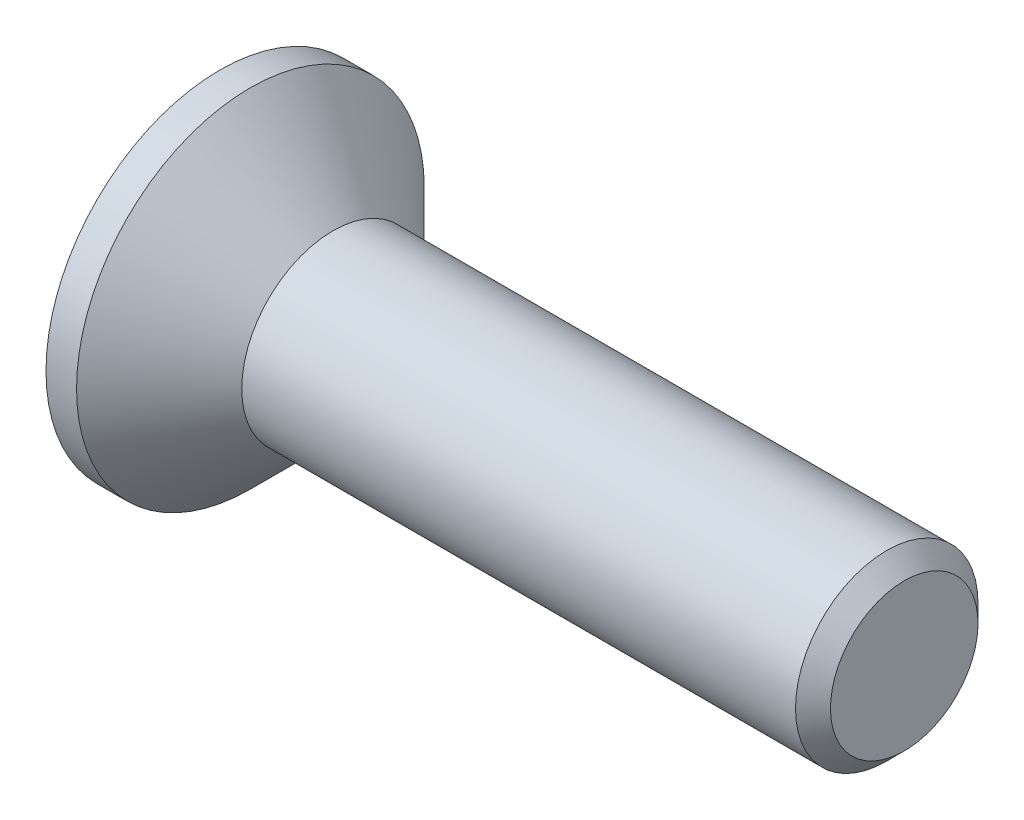
ISO-10303-21;
HEADER;
FILE_DESCRIPTION(('STEP AP214'),'2;1');
FILE_NAME('part.step','',(''),(''),'','','');
FILE_SCHEMA(('AUTOMOTIVE_DESIGN { 1 0 10303 214 1 1 1 1 }'));
ENDSEC;
DATA;
#1=APPLICATION_CONTEXT('core data for automotive mechanical design processes');
#2=APPLICATION_PROTOCOL_DEFINITION('international standard','automotive_design',2000,#1);
#3=PRODUCT_CONTEXT('',#1,'mechanical');
#4=PRODUCT('Part','Part','',(#3));
#5=PRODUCT_RELATED_PRODUCT_CATEGORY('part','',(#4));
#6=PRODUCT_DEFINITION_FORMATION('','',#4);
#7=PRODUCT_DEFINITION_CONTEXT('part definition',#1,'design');
#8=PRODUCT_DEFINITION('design','',#6,#7);
#9=PRODUCT_DEFINITION_SHAPE('','',#8);
#10=(LENGTH_UNIT() NAMED_UNIT(*) SI_UNIT(.MILLI.,.METRE.));
#11=(NAMED_UNIT(*) PLANE_ANGLE_UNIT() SI_UNIT($,.RADIAN.));
#12=(NAMED_UNIT(*) SI_UNIT($,.STERADIAN.) SOLID_ANGLE_UNIT());
#13=UNCERTAINTY_MEASURE_WITH_UNIT(LENGTH_MEASURE(1.E-05),#10,'distance_accuracy_value','');
#14=(GEOMETRIC_REPRESENTATION_CONTEXT(3) GLOBAL_UNCERTAINTY_ASSIGNED_CONTEXT((#13)) GLOBAL_UNIT_ASSIGNED_CONTEXT((#10,
#11,#12)) REPRESENTATION_CONTEXT('',''));
#15=CARTESIAN_POINT('',(0.,0.,0.));
#16=DIRECTION('',(0.,0.,1.));
#17=DIRECTION('',(1.,0.,0.));
#18=AXIS2_PLACEMENT_3D('',#15,#16,#17);
#19=CARTESIAN_POINT('',(3.15,0.,0.));
#20=DIRECTION('',(-1.,0.,0.));
#21=DIRECTION('',(0.,1.,0.));
#22=AXIS2_PLACEMENT_3D('',#19,#20,#21);
#23=CONICAL_SURFACE('',#22,5.81,0.785398163397447);
#24=CARTESIAN_POINT('',(4.96,0.,0.));
#25=DIRECTION('',(1.,0.,0.));
#26=DIRECTION('',(0.,1.,0.));
#27=AXIS2_PLACEMENT_3D('',#24,#25,#26);
#28=CIRCLE('',#27,4.);
#29=CARTESIAN_POINT('',(4.96,-4.,0.));
#30=VERTEX_POINT('',#29);
#31=EDGE_CURVE('E167',#30,#30,#28,.T.);
#32=ORIENTED_EDGE('',*,*,#31,.F.);
#33=DIRECTION('',(-0.707106781186548,-0.707106781186547,0.));
#34=VECTOR('',#33,1.);
#35=CARTESIAN_POINT('',(3.15,-5.81,0.));
#36=LINE('',#35,#34);
#37=CARTESIAN_POINT('',(1.33999999999998,-7.62,0.));
#38=VERTEX_POINT('',#37);
#39=EDGE_CURVE('E10',#30,#38,#36,.T.);
#40=ORIENTED_EDGE('',*,*,#39,.T.);
#41=CARTESIAN_POINT('',(1.33999999999998,0.,0.));
#42=DIRECTION('',(1.,0.,0.));
#43=DIRECTION('',(0.,1.,0.));
#44=AXIS2_PLACEMENT_3D('',#41,#42,#43);
#45=CIRCLE('',#44,7.62);
#46=EDGE_CURVE('E154',#38,#38,#45,.T.);
#47=ORIENTED_EDGE('',*,*,#46,.T.);
#48=ORIENTED_EDGE('',*,*,#39,.F.);
#49=EDGE_LOOP('',(#32,#40,#47,#48));
#50=FACE_BOUND('',#49,.T.);
#51=ADVANCED_FACE('F16',(#50),#23,.T.);
#52=CARTESIAN_POINT('',(0.669999999999988,0.,0.));
#53=DIRECTION('',(1.,0.,0.));
#54=DIRECTION('',(0.,1.,0.));
#55=AXIS2_PLACEMENT_3D('',#52,#53,#54);
#56=CYLINDRICAL_SURFACE('',#55,7.62);
#57=ORIENTED_EDGE('',*,*,#46,.F.);
#58=DIRECTION('',(-1.,0.,0.));
#59=VECTOR('',#58,1.);
#60=CARTESIAN_POINT('',(0.669999999999988,-7.62,0.));
#61=LINE('',#60,#59);
#62=CARTESIAN_POINT('',(0.,-7.62,0.));
#63=VERTEX_POINT('',#62);
#64=EDGE_CURVE('E27',#38,#63,#61,.T.);
#65=ORIENTED_EDGE('',*,*,#64,.T.);
#66=CARTESIAN_POINT('',(0.,0.,0.));
#67=DIRECTION('',(1.,0.,0.));
#68=DIRECTION('',(0.,1.,0.));
#69=AXIS2_PLACEMENT_3D('',#66,#67,#68);
#70=CIRCLE('',#69,7.62);
#71=EDGE_CURVE('E179',#63,#63,#70,.T.);
#72=ORIENTED_EDGE('',*,*,#71,.T.);
#73=ORIENTED_EDGE('',*,*,#64,.F.);
#74=EDGE_LOOP('',(#57,#65,#72,#73));
#75=FACE_BOUND('',#74,.T.);
#76=ADVANCED_FACE('F290',(#75),#56,.T.);
#77=CARTESIAN_POINT('',(0.,5.25337567297407,0.));
#78=DIRECTION('',(-1.,0.,0.));
#79=DIRECTION('',(0.,1.,0.));
#80=AXIS2_PLACEMENT_3D('',#77,#78,#79);
#81=PLANE('',#80);
#82=DIRECTION('',(0.,0.,1.));
#83=VECTOR('',#82,1.);
#84=CARTESIAN_POINT('',(0.,2.5,0.790745250436345));
#85=LINE('',#84,#83);
#86=CARTESIAN_POINT('',(0.,2.5,-1.44337567297406));
#87=VERTEX_POINT('',#86);
#88=CARTESIAN_POINT('',(0.,2.5,1.44337567297406));
#89=VERTEX_POINT('',#88);
#90=EDGE_CURVE('E114',#87,#89,#85,.T.);
#91=ORIENTED_EDGE('',*,*,#90,.T.);
#92=DIRECTION('',(0.,-0.866025403784438,0.5));
#93=VECTOR('',#92,1.);
#94=CARTESIAN_POINT('',(0.,0.646890323062105,2.51326904379206));
#95=LINE('',#94,#93);
#96=CARTESIAN_POINT('',(0.,0.,2.88675134594813));
#97=VERTEX_POINT('',#96);
#98=EDGE_CURVE('E180',#89,#97,#95,.T.);
#99=ORIENTED_EDGE('',*,*,#98,.T.);
#100=DIRECTION('',(0.,-0.866025403784439,-0.5));
#101=VECTOR('',#100,1.);
#102=CARTESIAN_POINT('',(0.,-1.79330420213813,1.85138668210479));
#103=LINE('',#102,#101);
#104=CARTESIAN_POINT('',(0.,-2.5,1.44337567297406));
#105=VERTEX_POINT('',#104);
#106=EDGE_CURVE('E215',#97,#105,#103,.T.);
#107=ORIENTED_EDGE('',*,*,#106,.T.);
#108=DIRECTION('',(0.,0.,-1.));
#109=VECTOR('',#108,1.);
#110=CARTESIAN_POINT('',(0.,-2.5,-0.652630422537716));
#111=LINE('',#110,#109);
#112=CARTESIAN_POINT('',(0.,-2.5,-1.44337567297406));
#113=VERTEX_POINT('',#112);
#114=EDGE_CURVE('E168',#105,#113,#111,.T.);
#115=ORIENTED_EDGE('',*,*,#114,.T.);
#116=DIRECTION('',(0.,0.866025403784439,-0.5));
#117=VECTOR('',#116,1.);
#118=CARTESIAN_POINT('',(0.,-0.603109676937896,-2.53854581161717));
#119=LINE('',#118,#117);
#120=CARTESIAN_POINT('',(0.,0.,-2.88675134594813));
#121=VERTEX_POINT('',#120);
#122=EDGE_CURVE('E143',#113,#121,#119,.T.);
#123=ORIENTED_EDGE('',*,*,#122,.T.);
#124=DIRECTION('',(0.,0.866025403784439,0.5));
#125=VECTOR('',#124,1.);
#126=CARTESIAN_POINT('',(0.,1.95669579786187,-1.75705250033037));
#127=LINE('',#126,#125);
#128=EDGE_CURVE('E130',#121,#87,#127,.T.);
#129=ORIENTED_EDGE('',*,*,#128,.T.);
#130=EDGE_LOOP('',(#91,#99,#107,#115,#123,#129));
#131=FACE_BOUND('',#130,.T.);
#132=ORIENTED_EDGE('',*,*,#71,.F.);
#133=EDGE_LOOP('',(#132));
#134=FACE_BOUND('',#133,.T.);
#135=ADVANCED_FACE('F212',(#131,#134),#81,.T.);
#136=CARTESIAN_POINT('',(3.83333333333334,0.,0.));
#137=DIRECTION('',(-1.,0.,0.));
#138=DIRECTION('',(0.,1.,0.));
#139=AXIS2_PLACEMENT_3D('',#136,#137,#138);
#140=CONICAL_SURFACE('',#139,1.44337567297406,1.0471975511966);
#141=DIRECTION('',(-0.5,-0.866025403784439,0.));
#142=VECTOR('',#141,1.);
#143=CARTESIAN_POINT('',(3.83333333333334,-1.44337567297406,0.));
#144=LINE('',#143,#142);
#145=CARTESIAN_POINT('',(4.66666666666667,0.,0.));
#146=VERTEX_POINT('',#145);
#147=CARTESIAN_POINT('',(3.22329099369261,-2.5,0.));
#148=VERTEX_POINT('',#147);
#149=EDGE_CURVE('E176',#146,#148,#144,.T.);
#150=ORIENTED_EDGE('',*,*,#149,.T.);
#151=CARTESIAN_POINT('',(3.22329099369261,-2.5,0.));
#152=CARTESIAN_POINT('',(3.22329099369261,-2.5,0.669872981077812));
#153=CARTESIAN_POINT('',(3.,-2.5,1.44337567297407));
#154=(BOUNDED_CURVE() B_SPLINE_CURVE(2,(#151,#152,#153),.UNSPECIFIED.,.F.,
.F.) B_SPLINE_CURVE_WITH_KNOTS((3,3),(0.146054517259741,0.292109034519481),
.UNSPECIFIED.) CURVE() GEOMETRIC_REPRESENTATION_ITEM() RATIONAL_B_SPLINE_CURVE((1.07735026918962,
1.07735026918962,1.)) REPRESENTATION_ITEM(''));
#155=CARTESIAN_POINT('',(3.,-2.5,1.44337567297407));
#156=VERTEX_POINT('',#155);
#157=EDGE_CURVE('E192',#148,#156,#154,.T.);
#158=ORIENTED_EDGE('',*,*,#157,.T.);
#159=CARTESIAN_POINT('',(3.,-2.5,1.44337567297406));
#160=CARTESIAN_POINT('',(3.41666666666667,-1.25,2.1650635094611));
#161=CARTESIAN_POINT('',(3.,0.,2.88675134594813));
#162=(BOUNDED_CURVE() B_SPLINE_CURVE(2,(#159,#160,#161),.UNSPECIFIED.,.F.,
.F.) B_SPLINE_CURVE_WITH_KNOTS((3,3),(0.,0.292109034519481),
.UNSPECIFIED.) CURVE() GEOMETRIC_REPRESENTATION_ITEM() RATIONAL_B_SPLINE_CURVE((1.,
1.15470053837925,1.)) REPRESENTATION_ITEM(''));
#163=CARTESIAN_POINT('',(3.,0.,2.88675134594813));
#164=VERTEX_POINT('',#163);
#165=EDGE_CURVE('E188',#156,#164,#162,.T.);
#166=ORIENTED_EDGE('',*,*,#165,.T.);
#167=CARTESIAN_POINT('',(3.,0.,2.88675134594813));
#168=CARTESIAN_POINT('',(3.41666666666667,1.25,2.1650635094611));
#169=CARTESIAN_POINT('',(3.,2.5,1.44337567297406));
#170=(BOUNDED_CURVE() B_SPLINE_CURVE(2,(#167,#168,#169),.UNSPECIFIED.,.F.,
.F.) B_SPLINE_CURVE_WITH_KNOTS((3,3),(0.,0.292109034519482),
.UNSPECIFIED.) CURVE() GEOMETRIC_REPRESENTATION_ITEM() RATIONAL_B_SPLINE_CURVE((1.,
1.15470053837925,1.)) REPRESENTATION_ITEM(''));
#171=CARTESIAN_POINT('',(3.,2.5,1.44337567297406));
#172=VERTEX_POINT('',#171);
#173=EDGE_CURVE('E127',#164,#172,#170,.T.);
#174=ORIENTED_EDGE('',*,*,#173,.T.);
#175=CARTESIAN_POINT('',(3.,2.5,1.44337567297407));
#176=CARTESIAN_POINT('',(3.41666666666667,2.5,0.));
#177=CARTESIAN_POINT('',(3.,2.5,-1.44337567297407));
#178=(BOUNDED_CURVE() B_SPLINE_CURVE(2,(#175,#176,#177),.UNSPECIFIED.,.F.,
.F.) B_SPLINE_CURVE_WITH_KNOTS((3,3),(0.,0.292109034519481),
.UNSPECIFIED.) CURVE() GEOMETRIC_REPRESENTATION_ITEM() RATIONAL_B_SPLINE_CURVE((1.,
1.15470053837926,1.)) REPRESENTATION_ITEM(''));
#179=CARTESIAN_POINT('',(3.,2.5,-1.44337567297407));
#180=VERTEX_POINT('',#179);
#181=EDGE_CURVE('E121',#172,#180,#178,.T.);
#182=ORIENTED_EDGE('',*,*,#181,.T.);
#183=CARTESIAN_POINT('',(3.,2.5,-1.44337567297406));
#184=CARTESIAN_POINT('',(3.41666666666667,1.25,-2.1650635094611));
#185=CARTESIAN_POINT('',(3.,0.,-2.88675134594813));
#186=(BOUNDED_CURVE() B_SPLINE_CURVE(2,(#183,#184,#185),.UNSPECIFIED.,.F.,
.F.) B_SPLINE_CURVE_WITH_KNOTS((3,3),(0.,0.292109034519482),
.UNSPECIFIED.) CURVE() GEOMETRIC_REPRESENTATION_ITEM() RATIONAL_B_SPLINE_CURVE((1.,
1.15470053837925,1.)) REPRESENTATION_ITEM(''));
#187=CARTESIAN_POINT('',(3.,0.,-2.88675134594813));
#188=VERTEX_POINT('',#187);
#189=EDGE_CURVE('E124',#180,#188,#186,.T.);
#190=ORIENTED_EDGE('',*,*,#189,.T.);
#191=CARTESIAN_POINT('',(3.,0.,-2.88675134594813));
#192=CARTESIAN_POINT('',(3.41666666666667,-1.25,-2.1650635094611));
#193=CARTESIAN_POINT('',(3.,-2.5,-1.44337567297406));
#194=(BOUNDED_CURVE() B_SPLINE_CURVE(2,(#191,#192,#193),.UNSPECIFIED.,.F.,
.F.) B_SPLINE_CURVE_WITH_KNOTS((3,3),(0.,0.292109034519482),
.UNSPECIFIED.) CURVE() GEOMETRIC_REPRESENTATION_ITEM() RATIONAL_B_SPLINE_CURVE((1.,
1.15470053837925,1.)) REPRESENTATION_ITEM(''));
#195=CARTESIAN_POINT('',(3.,-2.5,-1.44337567297406));
#196=VERTEX_POINT('',#195);
#197=EDGE_CURVE('E247',#188,#196,#194,.T.);
#198=ORIENTED_EDGE('',*,*,#197,.T.);
#199=CARTESIAN_POINT('',(3.,-2.5,-1.44337567297407));
#200=CARTESIAN_POINT('',(3.22329099369261,-2.5,-0.669872981077811));
#201=CARTESIAN_POINT('',(3.22329099369261,-2.5,0.));
#202=(BOUNDED_CURVE() B_SPLINE_CURVE(2,(#199,#200,#201),.UNSPECIFIED.,.F.,
.F.) B_SPLINE_CURVE_WITH_KNOTS((3,3),(0.,0.146054517259741),
.UNSPECIFIED.) CURVE() GEOMETRIC_REPRESENTATION_ITEM() RATIONAL_B_SPLINE_CURVE((1.,
1.07735026918962,1.07735026918962)) REPRESENTATION_ITEM(''));
#203=EDGE_CURVE('E160',#196,#148,#202,.T.);
#204=ORIENTED_EDGE('',*,*,#203,.T.);
#205=ORIENTED_EDGE('',*,*,#149,.F.);
#206=EDGE_LOOP('',(#150,#158,#166,#174,#182,#190,#198,#204,#205));
#207=FACE_BOUND('',#206,.T.);
#208=ADVANCED_FACE('F122',(#207),#140,.F.);
#209=CARTESIAN_POINT('',(0.,0.,2.88675134594813));
#210=DIRECTION('',(0.,0.5,0.866025403784438));
#211=DIRECTION('',(1.,0.,0.));
#212=AXIS2_PLACEMENT_3D('',#209,#210,#211);
#213=PLANE('',#212);
#214=ORIENTED_EDGE('',*,*,#173,.F.);
#215=DIRECTION('',(-1.,0.,0.));
#216=VECTOR('',#215,1.);
#217=CARTESIAN_POINT('',(1.5,0.,2.88675134594813));
#218=LINE('',#217,#216);
#219=EDGE_CURVE('E197',#164,#97,#218,.T.);
#220=ORIENTED_EDGE('',*,*,#219,.T.);
#221=ORIENTED_EDGE('',*,*,#98,.F.);
#222=DIRECTION('',(1.,0.,0.));
#223=VECTOR('',#222,1.);
#224=CARTESIAN_POINT('',(1.5,2.5,1.44337567297406));
#225=LINE('',#224,#223);
#226=EDGE_CURVE('E20',#89,#172,#225,.T.);
#227=ORIENTED_EDGE('',*,*,#226,.T.);
#228=EDGE_LOOP('',(#214,#220,#221,#227));
#229=FACE_BOUND('',#228,.T.);
#230=ADVANCED_FACE('F218',(#229),#213,.F.);
#231=CARTESIAN_POINT('',(0.,-2.5,1.44337567297406));
#232=DIRECTION('',(0.,-0.5,0.866025403784439));
#233=DIRECTION('',(-1.,0.,0.));
#234=AXIS2_PLACEMENT_3D('',#231,#232,#233);
#235=PLANE('',#234);
#236=ORIENTED_EDGE('',*,*,#165,.F.);
#237=DIRECTION('',(-1.,0.,0.));
#238=VECTOR('',#237,1.);
#239=CARTESIAN_POINT('',(1.5,-2.5,1.44337567297406));
#240=LINE('',#239,#238);
#241=EDGE_CURVE('E175',#156,#105,#240,.T.);
#242=ORIENTED_EDGE('',*,*,#241,.T.);
#243=ORIENTED_EDGE('',*,*,#106,.F.);
#244=ORIENTED_EDGE('',*,*,#219,.F.);
#245=EDGE_LOOP('',(#236,#242,#243,#244));
#246=FACE_BOUND('',#245,.T.);
#247=ADVANCED_FACE('F221',(#246),#235,.F.);
#248=CARTESIAN_POINT('',(0.,2.5,1.44337567297406));
#249=DIRECTION('',(0.,1.,0.));
#250=DIRECTION('',(0.,0.,-1.));
#251=AXIS2_PLACEMENT_3D('',#248,#249,#250);
#252=PLANE('',#251);
#253=ORIENTED_EDGE('',*,*,#181,.F.);
#254=ORIENTED_EDGE('',*,*,#226,.F.);
#255=ORIENTED_EDGE('',*,*,#90,.F.);
#256=DIRECTION('',(-1.,0.,0.));
#257=VECTOR('',#256,1.);
#258=CARTESIAN_POINT('',(1.5,2.5,-1.44337567297407));
#259=LINE('',#258,#257);
#260=EDGE_CURVE('E133',#180,#87,#259,.T.);
#261=ORIENTED_EDGE('',*,*,#260,.F.);
#262=EDGE_LOOP('',(#253,#254,#255,#261));
#263=FACE_BOUND('',#262,.T.);
#264=ADVANCED_FACE('F134',(#263),#252,.F.);
#265=CARTESIAN_POINT('',(0.,2.5,-1.44337567297406));
#266=DIRECTION('',(0.,0.5,-0.866025403784439));
#267=DIRECTION('',(-1.,0.,0.));
#268=AXIS2_PLACEMENT_3D('',#265,#266,#267);
#269=PLANE('',#268);
#270=ORIENTED_EDGE('',*,*,#189,.F.);
#271=ORIENTED_EDGE('',*,*,#260,.T.);
#272=ORIENTED_EDGE('',*,*,#128,.F.);
#273=DIRECTION('',(-1.,0.,0.));
#274=VECTOR('',#273,1.);
#275=CARTESIAN_POINT('',(1.5,0.,-2.88675134594813));
#276=LINE('',#275,#274);
#277=EDGE_CURVE('E140',#188,#121,#276,.T.);
#278=ORIENTED_EDGE('',*,*,#277,.F.);
#279=EDGE_LOOP('',(#270,#271,#272,#278));
#280=FACE_BOUND('',#279,.T.);
#281=ADVANCED_FACE('F138',(#280),#269,.F.);
#282=CARTESIAN_POINT('',(0.,0.,-2.88675134594813));
#283=DIRECTION('',(0.,-0.5,-0.866025403784439));
#284=DIRECTION('',(0.,-0.866025403784439,0.5));
#285=AXIS2_PLACEMENT_3D('',#282,#283,#284);
#286=PLANE('',#285);
#287=ORIENTED_EDGE('',*,*,#197,.F.);
#288=ORIENTED_EDGE('',*,*,#277,.T.);
#289=ORIENTED_EDGE('',*,*,#122,.F.);
#290=DIRECTION('',(-1.,0.,0.));
#291=VECTOR('',#290,1.);
#292=CARTESIAN_POINT('',(1.5,-2.5,-1.44337567297406));
#293=LINE('',#292,#291);
#294=EDGE_CURVE('E166',#196,#113,#293,.T.);
#295=ORIENTED_EDGE('',*,*,#294,.F.);
#296=EDGE_LOOP('',(#287,#288,#289,#295));
#297=FACE_BOUND('',#296,.T.);
#298=ADVANCED_FACE('F259',(#297),#286,.F.);
#299=CARTESIAN_POINT('',(0.,-2.5,-1.44337567297406));
#300=DIRECTION('',(0.,-1.,0.));
#301=DIRECTION('',(-1.,0.,0.));
#302=AXIS2_PLACEMENT_3D('',#299,#300,#301);
#303=PLANE('',#302);
#304=ORIENTED_EDGE('',*,*,#203,.F.);
#305=ORIENTED_EDGE('',*,*,#294,.T.);
#306=ORIENTED_EDGE('',*,*,#114,.F.);
#307=ORIENTED_EDGE('',*,*,#241,.F.);
#308=ORIENTED_EDGE('',*,*,#157,.F.);
#309=EDGE_LOOP('',(#304,#305,#306,#307,#308));
#310=FACE_BOUND('',#309,.T.);
#311=ADVANCED_FACE('F264',(#310),#303,.F.);
#312=CARTESIAN_POINT('',(30.,2.,0.));
#313=DIRECTION('',(1.,0.,0.));
#314=DIRECTION('',(0.,1.,0.));
#315=AXIS2_PLACEMENT_3D('',#312,#313,#314);
#316=PLANE('',#315);
#317=CARTESIAN_POINT('',(30.,0.,0.));
#318=DIRECTION('',(-1.,0.,0.));
#319=DIRECTION('',(0.,-1.,0.));
#320=AXIS2_PLACEMENT_3D('',#317,#318,#319);
#321=CIRCLE('',#320,3.23318749999999);
#322=CARTESIAN_POINT('',(30.,3.23318749999999,0.));
#323=VERTEX_POINT('',#322);
#324=EDGE_CURVE('E240',#323,#323,#321,.T.);
#325=ORIENTED_EDGE('',*,*,#324,.F.);
#326=EDGE_LOOP('',(#325));
#327=FACE_BOUND('',#326,.T.);
#328=ADVANCED_FACE('F302',(#327),#316,.T.);
#329=CARTESIAN_POINT('',(19.5,0.,0.));
#330=DIRECTION('',(1.,0.,0.));
#331=DIRECTION('',(0.,1.,0.));
#332=AXIS2_PLACEMENT_3D('',#329,#330,#331);
#333=CYLINDRICAL_SURFACE('',#332,4.);
#334=CARTESIAN_POINT('',(29.2331875,0.,0.));
#335=DIRECTION('',(1.,0.,0.));
#336=DIRECTION('',(0.,-1.,0.));
#337=AXIS2_PLACEMENT_3D('',#334,#335,#336);
#338=CIRCLE('',#337,4.);
#339=CARTESIAN_POINT('',(29.2331875,4.,0.));
#340=VERTEX_POINT('',#339);
#341=CARTESIAN_POINT('',(29.2331875,-4.,0.));
#342=VERTEX_POINT('',#341);
#343=EDGE_CURVE('E185',#340,#342,#338,.T.);
#344=ORIENTED_EDGE('',*,*,#343,.F.);
#345=CARTESIAN_POINT('',(29.2331875,0.,0.));
#346=DIRECTION('',(1.,0.,0.));
#347=DIRECTION('',(0.,-1.,0.));
#348=AXIS2_PLACEMENT_3D('',#345,#346,#347);
#349=CIRCLE('',#348,4.);
#350=EDGE_CURVE('E181',#342,#340,#349,.T.);
#351=ORIENTED_EDGE('',*,*,#350,.F.);
#352=DIRECTION('',(-1.,0.,0.));
#353=VECTOR('',#352,1.);
#354=CARTESIAN_POINT('',(19.5,-4.,0.));
#355=LINE('',#354,#353);
#356=EDGE_CURVE('E184',#342,#30,#355,.T.);
#357=ORIENTED_EDGE('',*,*,#356,.T.);
#358=ORIENTED_EDGE('',*,*,#31,.T.);
#359=ORIENTED_EDGE('',*,*,#356,.F.);
#360=EDGE_LOOP('',(#344,#351,#357,#358,#359));
#361=FACE_BOUND('',#360,.T.);
#362=ADVANCED_FACE('F305',(#361),#333,.T.);
#363=CARTESIAN_POINT('',(29.61659375,0.,0.));
#364=DIRECTION('',(-1.,0.,0.));
#365=DIRECTION('',(0.,-1.,0.));
#366=AXIS2_PLACEMENT_3D('',#363,#364,#365);
#367=CONICAL_SURFACE('',#366,3.61659374999999,0.785398163397447);
#368=ORIENTED_EDGE('',*,*,#324,.T.);
#369=DIRECTION('',(-0.707106781186548,0.707106781186547,0.));
#370=VECTOR('',#369,1.);
#371=CARTESIAN_POINT('',(29.61659375,3.61659374999999,0.));
#372=LINE('',#371,#370);
#373=EDGE_CURVE('E204',#323,#340,#372,.T.);
#374=ORIENTED_EDGE('',*,*,#373,.T.);
#375=ORIENTED_EDGE('',*,*,#343,.T.);
#376=ORIENTED_EDGE('',*,*,#350,.T.);
#377=ORIENTED_EDGE('',*,*,#373,.F.);
#378=EDGE_LOOP('',(#368,#374,#375,#376,#377));
#379=FACE_BOUND('',#378,.T.);
#380=ADVANCED_FACE('F18',(#379),#367,.T.);
#381=CLOSED_SHELL('',(#51,#76,#135,#208,#230,#247,#264,#281,#298,#311,#328,#362,#380));
#382=MANIFOLD_SOLID_BREP('B1',#381);
#383=ADVANCED_BREP_SHAPE_REPRESENTATION('',(#18,#382),#14);
#384=SHAPE_DEFINITION_REPRESENTATION(#9,#383);
ENDSEC;
END-ISO-10303-21;
